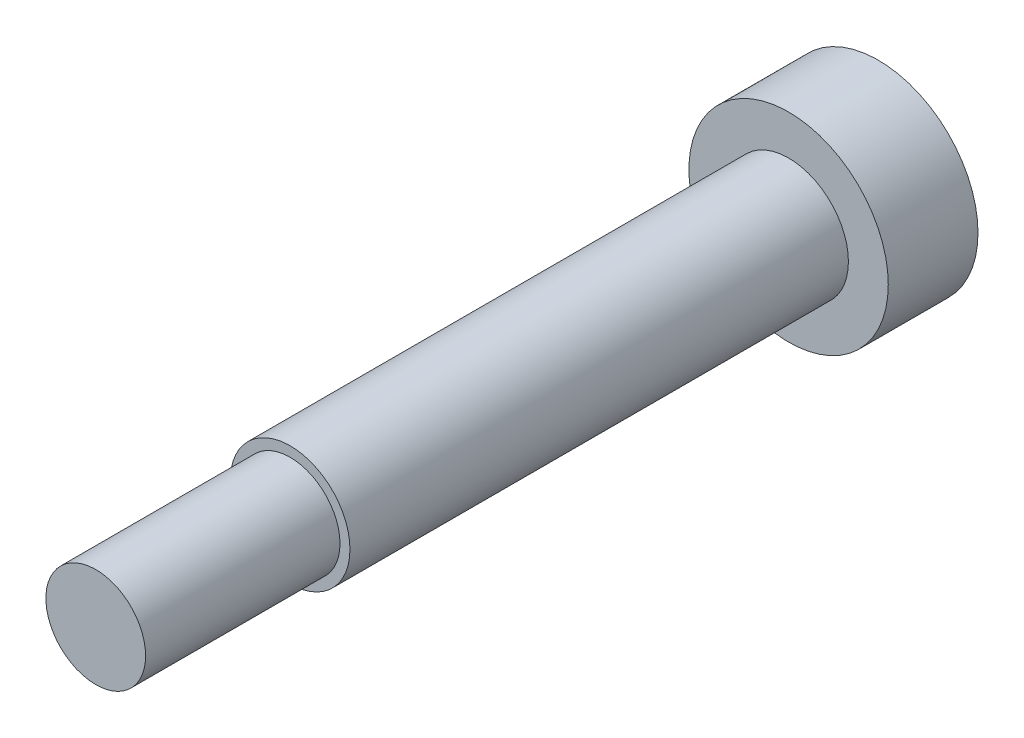
ISO-10303-21;
HEADER;
FILE_DESCRIPTION(('STEP AP214'),'2;1');
FILE_NAME('part.step','',(''),(''),'','','');
FILE_SCHEMA(('AUTOMOTIVE_DESIGN { 1 0 10303 214 1 1 1 1 }'));
ENDSEC;
DATA;
#1=APPLICATION_CONTEXT('core data for automotive mechanical design processes');
#2=APPLICATION_PROTOCOL_DEFINITION('international standard','automotive_design',2000,#1);
#3=PRODUCT_CONTEXT('',#1,'mechanical');
#4=PRODUCT('Part','Part','',(#3));
#5=PRODUCT_RELATED_PRODUCT_CATEGORY('part','',(#4));
#6=PRODUCT_DEFINITION_FORMATION('','',#4);
#7=PRODUCT_DEFINITION_CONTEXT('part definition',#1,'design');
#8=PRODUCT_DEFINITION('design','',#6,#7);
#9=PRODUCT_DEFINITION_SHAPE('','',#8);
#10=(LENGTH_UNIT() NAMED_UNIT(*) SI_UNIT(.MILLI.,.METRE.));
#11=(NAMED_UNIT(*) PLANE_ANGLE_UNIT() SI_UNIT($,.RADIAN.));
#12=(NAMED_UNIT(*) SI_UNIT($,.STERADIAN.) SOLID_ANGLE_UNIT());
#13=UNCERTAINTY_MEASURE_WITH_UNIT(LENGTH_MEASURE(1.E-05),#10,'distance_accuracy_value','');
#14=(GEOMETRIC_REPRESENTATION_CONTEXT(3) GLOBAL_UNCERTAINTY_ASSIGNED_CONTEXT((#13)) GLOBAL_UNIT_ASSIGNED_CONTEXT((#10,
#11,#12)) REPRESENTATION_CONTEXT('',''));
#15=CARTESIAN_POINT('',(0.,0.,0.));
#16=DIRECTION('',(0.,0.,1.));
#17=DIRECTION('',(1.,0.,0.));
#18=AXIS2_PLACEMENT_3D('',#15,#16,#17);
#19=CARTESIAN_POINT('',(0.,0.,4.5));
#20=DIRECTION('',(0.,0.,-1.));
#21=DIRECTION('',(-1.,0.,0.));
#22=AXIS2_PLACEMENT_3D('',#19,#20,#21);
#23=CYLINDRICAL_SURFACE('',#22,5.);
#24=CARTESIAN_POINT('',(0.,0.,4.5));
#25=DIRECTION('',(0.,0.,1.));
#26=DIRECTION('',(1.,0.,0.));
#27=AXIS2_PLACEMENT_3D('',#24,#25,#26);
#28=CIRCLE('',#27,5.);
#29=CARTESIAN_POINT('',(5.,0.,4.5));
#30=VERTEX_POINT('',#29);
#31=EDGE_CURVE('E46',#30,#30,#28,.T.);
#32=ORIENTED_EDGE('',*,*,#31,.F.);
#33=EDGE_LOOP('',(#32));
#34=FACE_BOUND('',#33,.T.);
#35=CARTESIAN_POINT('',(0.,0.,0.));
#36=DIRECTION('',(0.,0.,1.));
#37=DIRECTION('',(1.,0.,0.));
#38=AXIS2_PLACEMENT_3D('',#35,#36,#37);
#39=CIRCLE('',#38,5.);
#40=CARTESIAN_POINT('',(5.,0.,0.));
#41=VERTEX_POINT('',#40);
#42=EDGE_CURVE('E37',#41,#41,#39,.T.);
#43=ORIENTED_EDGE('',*,*,#42,.T.);
#44=EDGE_LOOP('',(#43));
#45=FACE_BOUND('',#44,.T.);
#46=ADVANCED_FACE('F34',(#34,#45),#23,.T.);
#47=CARTESIAN_POINT('',(0.,0.,4.5));
#48=DIRECTION('',(0.,0.,1.));
#49=DIRECTION('',(1.,0.,0.));
#50=AXIS2_PLACEMENT_3D('',#47,#48,#49);
#51=PLANE('',#50);
#52=CARTESIAN_POINT('',(0.,0.,4.5));
#53=DIRECTION('',(0.,0.,1.));
#54=DIRECTION('',(1.,0.,0.));
#55=AXIS2_PLACEMENT_3D('',#52,#53,#54);
#56=CIRCLE('',#55,3.);
#57=CARTESIAN_POINT('',(3.,0.,4.5));
#58=VERTEX_POINT('',#57);
#59=EDGE_CURVE('E41',#58,#58,#56,.T.);
#60=ORIENTED_EDGE('',*,*,#59,.F.);
#61=EDGE_LOOP('',(#60));
#62=FACE_BOUND('',#61,.T.);
#63=ORIENTED_EDGE('',*,*,#31,.T.);
#64=EDGE_LOOP('',(#63));
#65=FACE_BOUND('',#64,.T.);
#66=ADVANCED_FACE('F63',(#62,#65),#51,.T.);
#67=CARTESIAN_POINT('',(0.,0.,0.));
#68=DIRECTION('',(0.,0.,1.));
#69=DIRECTION('',(1.,0.,0.));
#70=AXIS2_PLACEMENT_3D('',#67,#68,#69);
#71=PLANE('',#70);
#72=ORIENTED_EDGE('',*,*,#42,.F.);
#73=EDGE_LOOP('',(#72));
#74=FACE_BOUND('',#73,.T.);
#75=ADVANCED_FACE('F60',(#74),#71,.F.);
#76=CARTESIAN_POINT('',(0.,0.,29.5));
#77=DIRECTION('',(0.,0.,-1.));
#78=DIRECTION('',(-1.,0.,0.));
#79=AXIS2_PLACEMENT_3D('',#76,#77,#78);
#80=CYLINDRICAL_SURFACE('',#79,3.);
#81=CARTESIAN_POINT('',(0.,0.,29.5));
#82=DIRECTION('',(0.,0.,1.));
#83=DIRECTION('',(1.,0.,0.));
#84=AXIS2_PLACEMENT_3D('',#81,#82,#83);
#85=CIRCLE('',#84,3.);
#86=CARTESIAN_POINT('',(3.,0.,29.5));
#87=VERTEX_POINT('',#86);
#88=EDGE_CURVE('E51',#87,#87,#85,.T.);
#89=ORIENTED_EDGE('',*,*,#88,.F.);
#90=EDGE_LOOP('',(#89));
#91=FACE_BOUND('',#90,.T.);
#92=ORIENTED_EDGE('',*,*,#59,.T.);
#93=EDGE_LOOP('',(#92));
#94=FACE_BOUND('',#93,.T.);
#95=ADVANCED_FACE('F62',(#91,#94),#80,.T.);
#96=CARTESIAN_POINT('',(0.,0.,29.5));
#97=DIRECTION('',(0.,0.,1.));
#98=DIRECTION('',(1.,0.,0.));
#99=AXIS2_PLACEMENT_3D('',#96,#97,#98);
#100=PLANE('',#99);
#101=CARTESIAN_POINT('',(0.,0.,29.5));
#102=DIRECTION('',(0.,0.,1.));
#103=DIRECTION('',(1.,0.,0.));
#104=AXIS2_PLACEMENT_3D('',#101,#102,#103);
#105=CIRCLE('',#104,2.5);
#106=CARTESIAN_POINT('',(2.5,0.,29.5));
#107=VERTEX_POINT('',#106);
#108=EDGE_CURVE('E10',#107,#107,#105,.T.);
#109=ORIENTED_EDGE('',*,*,#108,.F.);
#110=EDGE_LOOP('',(#109));
#111=FACE_BOUND('',#110,.T.);
#112=ORIENTED_EDGE('',*,*,#88,.T.);
#113=EDGE_LOOP('',(#112));
#114=FACE_BOUND('',#113,.T.);
#115=ADVANCED_FACE('F68',(#111,#114),#100,.T.);
#116=CARTESIAN_POINT('',(0.,0.,39.25));
#117=DIRECTION('',(0.,0.,-1.));
#118=DIRECTION('',(-1.,0.,0.));
#119=AXIS2_PLACEMENT_3D('',#116,#117,#118);
#120=CYLINDRICAL_SURFACE('',#119,2.5);
#121=CARTESIAN_POINT('',(0.,0.,39.25));
#122=DIRECTION('',(0.,0.,1.));
#123=DIRECTION('',(1.,0.,0.));
#124=AXIS2_PLACEMENT_3D('',#121,#122,#123);
#125=CIRCLE('',#124,2.5);
#126=CARTESIAN_POINT('',(2.5,0.,39.25));
#127=VERTEX_POINT('',#126);
#128=EDGE_CURVE('E50',#127,#127,#125,.T.);
#129=ORIENTED_EDGE('',*,*,#128,.F.);
#130=EDGE_LOOP('',(#129));
#131=FACE_BOUND('',#130,.T.);
#132=ORIENTED_EDGE('',*,*,#108,.T.);
#133=EDGE_LOOP('',(#132));
#134=FACE_BOUND('',#133,.T.);
#135=ADVANCED_FACE('F98',(#131,#134),#120,.T.);
#136=CARTESIAN_POINT('',(0.,0.,39.25));
#137=DIRECTION('',(0.,0.,1.));
#138=DIRECTION('',(1.,0.,0.));
#139=AXIS2_PLACEMENT_3D('',#136,#137,#138);
#140=PLANE('',#139);
#141=ORIENTED_EDGE('',*,*,#128,.T.);
#142=EDGE_LOOP('',(#141));
#143=FACE_BOUND('',#142,.T.);
#144=ADVANCED_FACE('F109',(#143),#140,.T.);
#145=CLOSED_SHELL('',(#46,#66,#75,#95,#115,#135,#144));
#146=MANIFOLD_SOLID_BREP('B2',#145);
#147=ADVANCED_BREP_SHAPE_REPRESENTATION('',(#18,#146),#14);
#148=SHAPE_DEFINITION_REPRESENTATION(#9,#147);
ENDSEC;
END-ISO-10303-21;
